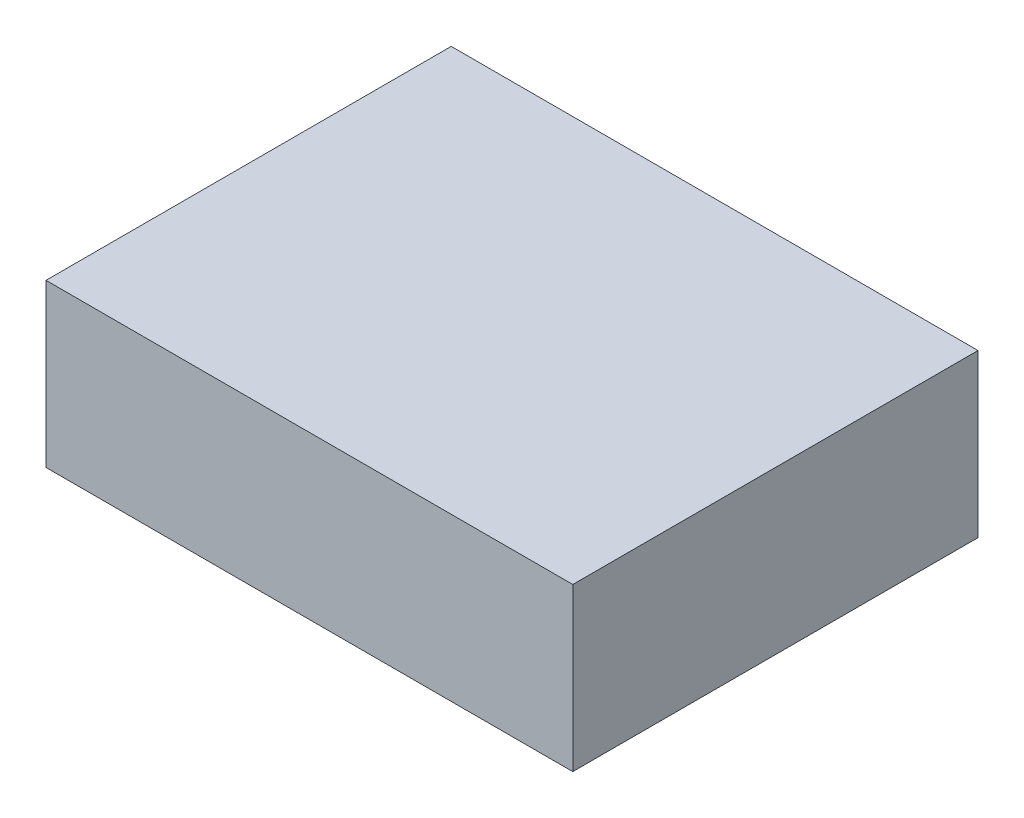
ISO-10303-21;
HEADER;
FILE_DESCRIPTION(('STEP AP214'),'2;1');
FILE_NAME('part.step','',(''),(''),'','','');
FILE_SCHEMA(('AUTOMOTIVE_DESIGN { 1 0 10303 214 1 1 1 1 }'));
ENDSEC;
DATA;
#1=APPLICATION_CONTEXT('core data for automotive mechanical design processes');
#2=APPLICATION_PROTOCOL_DEFINITION('international standard','automotive_design',2000,#1);
#3=PRODUCT_CONTEXT('',#1,'mechanical');
#4=PRODUCT('Part','Part','',(#3));
#5=PRODUCT_RELATED_PRODUCT_CATEGORY('part','',(#4));
#6=PRODUCT_DEFINITION_FORMATION('','',#4);
#7=PRODUCT_DEFINITION_CONTEXT('part definition',#1,'design');
#8=PRODUCT_DEFINITION('design','',#6,#7);
#9=PRODUCT_DEFINITION_SHAPE('','',#8);
#10=(LENGTH_UNIT() NAMED_UNIT(*) SI_UNIT(.MILLI.,.METRE.));
#11=(NAMED_UNIT(*) PLANE_ANGLE_UNIT() SI_UNIT($,.RADIAN.));
#12=(NAMED_UNIT(*) SI_UNIT($,.STERADIAN.) SOLID_ANGLE_UNIT());
#13=UNCERTAINTY_MEASURE_WITH_UNIT(LENGTH_MEASURE(1.E-05),#10,'distance_accuracy_value','');
#14=(GEOMETRIC_REPRESENTATION_CONTEXT(3) GLOBAL_UNCERTAINTY_ASSIGNED_CONTEXT((#13)) GLOBAL_UNIT_ASSIGNED_CONTEXT((#10,
#11,#12)) REPRESENTATION_CONTEXT('',''));
#15=CARTESIAN_POINT('',(0.,0.,0.));
#16=DIRECTION('',(0.,0.,1.));
#17=DIRECTION('',(1.,0.,0.));
#18=AXIS2_PLACEMENT_3D('',#15,#16,#17);
#19=CARTESIAN_POINT('',(32.5,20.,-25.));
#20=DIRECTION('',(-1.,0.,0.));
#21=DIRECTION('',(0.,0.,1.));
#22=AXIS2_PLACEMENT_3D('',#19,#20,#21);
#23=PLANE('',#22);
#24=DIRECTION('',(0.,0.,-1.));
#25=VECTOR('',#24,1.);
#26=CARTESIAN_POINT('',(32.5,0.,-25.));
#27=LINE('',#26,#25);
#28=CARTESIAN_POINT('',(32.5,0.,25.));
#29=VERTEX_POINT('',#28);
#30=CARTESIAN_POINT('',(32.5,0.,-25.));
#31=VERTEX_POINT('',#30);
#32=EDGE_CURVE('E106',#29,#31,#27,.T.);
#33=ORIENTED_EDGE('',*,*,#32,.T.);
#34=DIRECTION('',(0.,-1.,0.));
#35=VECTOR('',#34,1.);
#36=CARTESIAN_POINT('',(32.5,20.,-25.));
#37=LINE('',#36,#35);
#38=CARTESIAN_POINT('',(32.5,20.,-25.));
#39=VERTEX_POINT('',#38);
#40=EDGE_CURVE('E11',#39,#31,#37,.T.);
#41=ORIENTED_EDGE('',*,*,#40,.F.);
#42=DIRECTION('',(0.,0.,-1.));
#43=VECTOR('',#42,1.);
#44=CARTESIAN_POINT('',(32.5,20.,-25.));
#45=LINE('',#44,#43);
#46=CARTESIAN_POINT('',(32.5,20.,25.));
#47=VERTEX_POINT('',#46);
#48=EDGE_CURVE('E94',#47,#39,#45,.T.);
#49=ORIENTED_EDGE('',*,*,#48,.F.);
#50=DIRECTION('',(0.,-1.,0.));
#51=VECTOR('',#50,1.);
#52=CARTESIAN_POINT('',(32.5,20.,25.));
#53=LINE('',#52,#51);
#54=EDGE_CURVE('E105',#47,#29,#53,.T.);
#55=ORIENTED_EDGE('',*,*,#54,.T.);
#56=EDGE_LOOP('',(#33,#41,#49,#55));
#57=FACE_BOUND('',#56,.T.);
#58=ADVANCED_FACE('F43',(#57),#23,.F.);
#59=CARTESIAN_POINT('',(-32.5,20.,-25.));
#60=DIRECTION('',(0.,0.,1.));
#61=DIRECTION('',(1.,0.,0.));
#62=AXIS2_PLACEMENT_3D('',#59,#60,#61);
#63=PLANE('',#62);
#64=DIRECTION('',(-1.,0.,0.));
#65=VECTOR('',#64,1.);
#66=CARTESIAN_POINT('',(-32.5,0.,-25.));
#67=LINE('',#66,#65);
#68=CARTESIAN_POINT('',(-32.5,0.,-25.));
#69=VERTEX_POINT('',#68);
#70=EDGE_CURVE('E98',#31,#69,#67,.T.);
#71=ORIENTED_EDGE('',*,*,#70,.T.);
#72=DIRECTION('',(0.,-1.,0.));
#73=VECTOR('',#72,1.);
#74=CARTESIAN_POINT('',(-32.5,20.,-25.));
#75=LINE('',#74,#73);
#76=CARTESIAN_POINT('',(-32.5,20.,-25.));
#77=VERTEX_POINT('',#76);
#78=EDGE_CURVE('E51',#77,#69,#75,.T.);
#79=ORIENTED_EDGE('',*,*,#78,.F.);
#80=DIRECTION('',(-1.,0.,0.));
#81=VECTOR('',#80,1.);
#82=CARTESIAN_POINT('',(-32.5,20.,-25.));
#83=LINE('',#82,#81);
#84=EDGE_CURVE('E90',#39,#77,#83,.T.);
#85=ORIENTED_EDGE('',*,*,#84,.F.);
#86=ORIENTED_EDGE('',*,*,#40,.T.);
#87=EDGE_LOOP('',(#71,#79,#85,#86));
#88=FACE_BOUND('',#87,.T.);
#89=ADVANCED_FACE('F100',(#88),#63,.F.);
#90=CARTESIAN_POINT('',(-32.5,20.,-25.));
#91=DIRECTION('',(1.,0.,0.));
#92=DIRECTION('',(0.,0.,-1.));
#93=AXIS2_PLACEMENT_3D('',#90,#91,#92);
#94=PLANE('',#93);
#95=DIRECTION('',(0.,0.,1.));
#96=VECTOR('',#95,1.);
#97=CARTESIAN_POINT('',(-32.5,0.,-25.));
#98=LINE('',#97,#96);
#99=CARTESIAN_POINT('',(-32.5,0.,25.));
#100=VERTEX_POINT('',#99);
#101=EDGE_CURVE('E78',#69,#100,#98,.T.);
#102=ORIENTED_EDGE('',*,*,#101,.T.);
#103=DIRECTION('',(0.,-1.,0.));
#104=VECTOR('',#103,1.);
#105=CARTESIAN_POINT('',(-32.5,20.,25.));
#106=LINE('',#105,#104);
#107=CARTESIAN_POINT('',(-32.5,20.,25.));
#108=VERTEX_POINT('',#107);
#109=EDGE_CURVE('E97',#108,#100,#106,.T.);
#110=ORIENTED_EDGE('',*,*,#109,.F.);
#111=DIRECTION('',(0.,0.,1.));
#112=VECTOR('',#111,1.);
#113=CARTESIAN_POINT('',(-32.5,20.,-25.));
#114=LINE('',#113,#112);
#115=EDGE_CURVE('E95',#77,#108,#114,.T.);
#116=ORIENTED_EDGE('',*,*,#115,.F.);
#117=ORIENTED_EDGE('',*,*,#78,.T.);
#118=EDGE_LOOP('',(#102,#110,#116,#117));
#119=FACE_BOUND('',#118,.T.);
#120=ADVANCED_FACE('F99',(#119),#94,.F.);
#121=CARTESIAN_POINT('',(-32.5,20.,25.));
#122=DIRECTION('',(0.,0.,-1.));
#123=DIRECTION('',(-1.,0.,0.));
#124=AXIS2_PLACEMENT_3D('',#121,#122,#123);
#125=PLANE('',#124);
#126=DIRECTION('',(1.,0.,0.));
#127=VECTOR('',#126,1.);
#128=CARTESIAN_POINT('',(-32.5,0.,25.));
#129=LINE('',#128,#127);
#130=EDGE_CURVE('E85',#100,#29,#129,.T.);
#131=ORIENTED_EDGE('',*,*,#130,.T.);
#132=ORIENTED_EDGE('',*,*,#54,.F.);
#133=DIRECTION('',(1.,0.,0.));
#134=VECTOR('',#133,1.);
#135=CARTESIAN_POINT('',(-32.5,20.,25.));
#136=LINE('',#135,#134);
#137=EDGE_CURVE('E56',#108,#47,#136,.T.);
#138=ORIENTED_EDGE('',*,*,#137,.F.);
#139=ORIENTED_EDGE('',*,*,#109,.T.);
#140=EDGE_LOOP('',(#131,#132,#138,#139));
#141=FACE_BOUND('',#140,.T.);
#142=ADVANCED_FACE('F114',(#141),#125,.F.);
#143=CARTESIAN_POINT('',(0.,20.,0.));
#144=DIRECTION('',(0.,1.,0.));
#145=DIRECTION('',(0.,0.,1.));
#146=AXIS2_PLACEMENT_3D('',#143,#144,#145);
#147=PLANE('',#146);
#148=ORIENTED_EDGE('',*,*,#48,.T.);
#149=ORIENTED_EDGE('',*,*,#84,.T.);
#150=ORIENTED_EDGE('',*,*,#115,.T.);
#151=ORIENTED_EDGE('',*,*,#137,.T.);
#152=EDGE_LOOP('',(#148,#149,#150,#151));
#153=FACE_BOUND('',#152,.T.);
#154=ADVANCED_FACE('F89',(#153),#147,.T.);
#155=CARTESIAN_POINT('',(0.,0.,0.));
#156=DIRECTION('',(0.,1.,0.));
#157=DIRECTION('',(0.,0.,1.));
#158=AXIS2_PLACEMENT_3D('',#155,#156,#157);
#159=PLANE('',#158);
#160=ORIENTED_EDGE('',*,*,#32,.F.);
#161=ORIENTED_EDGE('',*,*,#130,.F.);
#162=ORIENTED_EDGE('',*,*,#101,.F.);
#163=ORIENTED_EDGE('',*,*,#70,.F.);
#164=EDGE_LOOP('',(#160,#161,#162,#163));
#165=FACE_BOUND('',#164,.T.);
#166=ADVANCED_FACE('F118',(#165),#159,.F.);
#167=CLOSED_SHELL('',(#58,#89,#120,#142,#154,#166));
#168=MANIFOLD_SOLID_BREP('B2',#167);
#169=ADVANCED_BREP_SHAPE_REPRESENTATION('',(#18,#168),#14);
#170=SHAPE_DEFINITION_REPRESENTATION(#9,#169);
ENDSEC;
END-ISO-10303-21;
